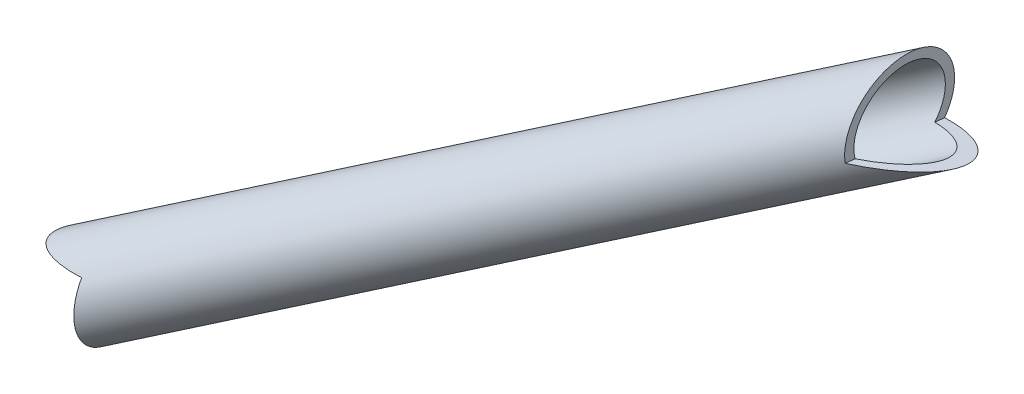
ISO-10303-21;
HEADER;
FILE_DESCRIPTION(('STEP AP214'),'2;1');
FILE_NAME('part.step','',(''),(''),'','','');
FILE_SCHEMA(('AUTOMOTIVE_DESIGN { 1 0 10303 214 1 1 1 1 }'));
ENDSEC;
DATA;
#1=APPLICATION_CONTEXT('core data for automotive mechanical design processes');
#2=APPLICATION_PROTOCOL_DEFINITION('international standard','automotive_design',2000,#1);
#3=PRODUCT_CONTEXT('',#1,'mechanical');
#4=PRODUCT('Part','Part','',(#3));
#5=PRODUCT_RELATED_PRODUCT_CATEGORY('part','',(#4));
#6=PRODUCT_DEFINITION_FORMATION('','',#4);
#7=PRODUCT_DEFINITION_CONTEXT('part definition',#1,'design');
#8=PRODUCT_DEFINITION('design','',#6,#7);
#9=PRODUCT_DEFINITION_SHAPE('','',#8);
#10=(LENGTH_UNIT() NAMED_UNIT(*) SI_UNIT(.MILLI.,.METRE.));
#11=(NAMED_UNIT(*) PLANE_ANGLE_UNIT() SI_UNIT($,.RADIAN.));
#12=(NAMED_UNIT(*) SI_UNIT($,.STERADIAN.) SOLID_ANGLE_UNIT());
#13=UNCERTAINTY_MEASURE_WITH_UNIT(LENGTH_MEASURE(1.E-05),#10,'distance_accuracy_value','');
#14=(GEOMETRIC_REPRESENTATION_CONTEXT(3) GLOBAL_UNCERTAINTY_ASSIGNED_CONTEXT((#13)) GLOBAL_UNIT_ASSIGNED_CONTEXT((#10,
#11,#12)) REPRESENTATION_CONTEXT('',''));
#15=CARTESIAN_POINT('',(0.,0.,0.));
#16=DIRECTION('',(0.,0.,1.));
#17=DIRECTION('',(1.,0.,0.));
#18=AXIS2_PLACEMENT_3D('',#15,#16,#17);
#19=CARTESIAN_POINT('',(60.0000000000001,-79.9999999999997,-1230.));
#20=DIRECTION('',(0.829530335169313,0.466321590167163,-0.307284229302213));
#21=DIRECTION('',(-0.490030345314348,0.871705374923833,0.));
#22=AXIS2_PLACEMENT_3D('',#19,#20,#21);
#23=CYLINDRICAL_SURFACE('',#22,9.49999999999999);
#24=CARTESIAN_POINT('',(191.800394642372,-5.90823143104675,-1278.8230278898));
#25=DIRECTION('',(0.993532672656404,0.,0.113546591160732));
#26=DIRECTION('',(0.0738720119307531,0.759431159814232,-0.646380104394088));
#27=AXIS2_PLACEMENT_3D('',#24,#25,#26);
#28=ELLIPSE('',#27,12.0363714180218,9.49999999999999);
#29=CARTESIAN_POINT('',(192.790177508074,-10.,-1287.48362796469));
#30=VERTEX_POINT('',#29);
#31=CARTESIAN_POINT('',(190.604637756446,-10.,-1268.36015513794));
#32=VERTEX_POINT('',#31);
#33=EDGE_CURVE('E89',#30,#32,#28,.T.);
#34=ORIENTED_EDGE('',*,*,#33,.F.);
#35=CARTESIAN_POINT('',(184.521627748431,-10.,-1276.12674279877));
#36=DIRECTION('',(0.,1.,0.));
#37=DIRECTION('',(0.937730066424403,0.,-0.347364826261505));
#38=AXIS2_PLACEMENT_3D('',#35,#36,#37);
#39=ELLIPSE('',#38,20.3722070783695,9.49999999999999);
#40=EDGE_CURVE('E83',#32,#30,#39,.T.);
#41=ORIENTED_EDGE('',*,*,#40,.F.);
#42=EDGE_LOOP('',(#34,#41));
#43=FACE_BOUND('',#42,.T.);
#44=CARTESIAN_POINT('',(77.7888039640615,-69.9999999999998,-1236.58953468554));
#45=DIRECTION('',(0.,-1.,0.));
#46=DIRECTION('',(0.937730066424403,0.,-0.347364826261505));
#47=AXIS2_PLACEMENT_3D('',#44,#45,#46);
#48=ELLIPSE('',#47,20.3722070783695,9.49999999999999);
#49=CARTESIAN_POINT('',(70.0000000000001,-69.9999999999998,-1225.25527457715));
#50=VERTEX_POINT('',#49);
#51=CARTESIAN_POINT('',(70.0000000000001,-69.9999999999998,-1243.53901067812));
#52=VERTEX_POINT('',#51);
#53=EDGE_CURVE('E92',#50,#52,#48,.T.);
#54=ORIENTED_EDGE('',*,*,#53,.F.);
#55=CARTESIAN_POINT('',(70.0000000000001,-74.3784865917892,-1233.70431575886));
#56=DIRECTION('',(-1.,0.,0.));
#57=DIRECTION('',(0.,0.835010933701049,-0.550233351042721));
#58=AXIS2_PLACEMENT_3D('',#55,#56,#57);
#59=ELLIPSE('',#58,11.4522635245895,9.49999999999999);
#60=EDGE_CURVE('E103',#52,#50,#59,.T.);
#61=ORIENTED_EDGE('',*,*,#60,.F.);
#62=EDGE_LOOP('',(#54,#61));
#63=FACE_BOUND('',#62,.T.);
#64=ADVANCED_FACE('F41',(#43,#63),#23,.T.);
#65=CARTESIAN_POINT('',(259.935326726564,-10.,-1698.86453408839));
#66=DIRECTION('',(0.,1.,0.));
#67=DIRECTION('',(0.,0.,1.));
#68=AXIS2_PLACEMENT_3D('',#65,#66,#67);
#69=PLANE('',#68);
#70=DIRECTION('',(-0.113546591160732,0.,0.993532672656404));
#71=VECTOR('',#70,1.);
#72=CARTESIAN_POINT('',(240.064673273436,-10.,-1701.13546591161));
#73=LINE('',#72,#71);
#74=CARTESIAN_POINT('',(190.821594147956,-10.,-1270.25852356366));
#75=VERTEX_POINT('',#74);
#76=EDGE_CURVE('E44',#75,#32,#73,.T.);
#77=ORIENTED_EDGE('',*,*,#76,.T.);
#78=ORIENTED_EDGE('',*,*,#40,.T.);
#79=CARTESIAN_POINT('',(192.573221116564,-10.,-1285.58525953898));
#80=VERTEX_POINT('',#79);
#81=EDGE_CURVE('E80',#30,#80,#73,.T.);
#82=ORIENTED_EDGE('',*,*,#81,.T.);
#83=CARTESIAN_POINT('',(184.521627748431,-10.,-1276.12674279877));
#84=DIRECTION('',(0.,1.,0.));
#85=DIRECTION('',(0.937730066424403,0.,-0.347364826261505));
#86=AXIS2_PLACEMENT_3D('',#83,#84,#85);
#87=ELLIPSE('',#86,16.941098517802,7.90000000000002);
#88=EDGE_CURVE('E75',#75,#80,#87,.T.);
#89=ORIENTED_EDGE('',*,*,#88,.F.);
#90=EDGE_LOOP('',(#77,#78,#82,#89));
#91=FACE_BOUND('',#90,.T.);
#92=ADVANCED_FACE('F85',(#91),#69,.T.);
#93=CARTESIAN_POINT('',(240.064673273436,10.,-1701.13546591161));
#94=DIRECTION('',(0.993532672656404,0.,0.113546591160732));
#95=DIRECTION('',(0.113546591160732,0.,-0.993532672656404));
#96=AXIS2_PLACEMENT_3D('',#93,#94,#95);
#97=PLANE('',#96);
#98=ORIENTED_EDGE('',*,*,#81,.F.);
#99=ORIENTED_EDGE('',*,*,#33,.T.);
#100=ORIENTED_EDGE('',*,*,#76,.F.);
#101=CARTESIAN_POINT('',(191.800394642372,-5.90823143104675,-1278.8230278898));
#102=DIRECTION('',(0.993532672656404,0.,0.113546591160732));
#103=DIRECTION('',(0.0738720119307531,0.759431159814232,-0.646380104394088));
#104=AXIS2_PLACEMENT_3D('',#101,#102,#103);
#105=ELLIPSE('',#104,10.009193073934,7.90000000000002);
#106=EDGE_CURVE('E99',#80,#75,#105,.T.);
#107=ORIENTED_EDGE('',*,*,#106,.F.);
#108=EDGE_LOOP('',(#98,#99,#100,#107));
#109=FACE_BOUND('',#108,.T.);
#110=ADVANCED_FACE('F90',(#109),#97,.T.);
#111=CARTESIAN_POINT('',(70.0000000000001,-69.9999999999998,-1085.));
#112=DIRECTION('',(0.,-1.,0.));
#113=DIRECTION('',(0.,0.,-1.));
#114=AXIS2_PLACEMENT_3D('',#111,#112,#113);
#115=PLANE('',#114);
#116=DIRECTION('',(0.,0.,-1.));
#117=VECTOR('',#116,1.);
#118=CARTESIAN_POINT('',(70.0000000000001,-69.9999999999998,-1085.));
#119=LINE('',#118,#117);
#120=CARTESIAN_POINT('',(70.0000000000001,-69.9999999999998,-1227.12865579034));
#121=VERTEX_POINT('',#120);
#122=EDGE_CURVE('E101',#50,#121,#119,.T.);
#123=ORIENTED_EDGE('',*,*,#122,.F.);
#124=ORIENTED_EDGE('',*,*,#53,.T.);
#125=CARTESIAN_POINT('',(70.0000000000001,-69.9999999999998,-1241.66562946492));
#126=VERTEX_POINT('',#125);
#127=EDGE_CURVE('E102',#126,#52,#119,.T.);
#128=ORIENTED_EDGE('',*,*,#127,.F.);
#129=CARTESIAN_POINT('',(77.7888039640615,-69.9999999999998,-1236.58953468554));
#130=DIRECTION('',(0.,-1.,0.));
#131=DIRECTION('',(0.937730066424403,0.,-0.347364826261505));
#132=AXIS2_PLACEMENT_3D('',#129,#130,#131);
#133=ELLIPSE('',#132,16.941098517802,7.90000000000002);
#134=EDGE_CURVE('E11',#121,#126,#133,.T.);
#135=ORIENTED_EDGE('',*,*,#134,.F.);
#136=EDGE_LOOP('',(#123,#124,#128,#135));
#137=FACE_BOUND('',#136,.T.);
#138=ADVANCED_FACE('F112',(#137),#115,.T.);
#139=CARTESIAN_POINT('',(70.0000000000001,-89.9999999999998,-1085.));
#140=DIRECTION('',(-1.,0.,0.));
#141=DIRECTION('',(0.,0.,1.));
#142=AXIS2_PLACEMENT_3D('',#139,#140,#141);
#143=PLANE('',#142);
#144=ORIENTED_EDGE('',*,*,#127,.T.);
#145=ORIENTED_EDGE('',*,*,#60,.T.);
#146=ORIENTED_EDGE('',*,*,#122,.T.);
#147=CARTESIAN_POINT('',(70.0000000000001,-74.3784865917892,-1233.70431575886));
#148=DIRECTION('',(-1.,0.,0.));
#149=DIRECTION('',(0.,0.835010933701049,-0.550233351042721));
#150=AXIS2_PLACEMENT_3D('',#147,#148,#149);
#151=ELLIPSE('',#150,9.52346124676389,7.90000000000002);
#152=EDGE_CURVE('E50',#126,#121,#151,.T.);
#153=ORIENTED_EDGE('',*,*,#152,.F.);
#154=EDGE_LOOP('',(#144,#145,#146,#153));
#155=FACE_BOUND('',#154,.T.);
#156=ADVANCED_FACE('F108',(#155),#143,.T.);
#157=CARTESIAN_POINT('',(60.0000000000001,-79.9999999999997,-1230.));
#158=DIRECTION('',(0.829530335169313,0.466321590167163,-0.307284229302213));
#159=DIRECTION('',(-0.490030345314348,0.871705374923833,0.));
#160=AXIS2_PLACEMENT_3D('',#157,#158,#159);
#161=CYLINDRICAL_SURFACE('',#160,7.90000000000002);
#162=ORIENTED_EDGE('',*,*,#88,.T.);
#163=ORIENTED_EDGE('',*,*,#106,.T.);
#164=EDGE_LOOP('',(#162,#163));
#165=FACE_BOUND('',#164,.T.);
#166=ORIENTED_EDGE('',*,*,#152,.T.);
#167=ORIENTED_EDGE('',*,*,#134,.T.);
#168=EDGE_LOOP('',(#166,#167));
#169=FACE_BOUND('',#168,.T.);
#170=ADVANCED_FACE('F114',(#165,#169),#161,.F.);
#171=CLOSED_SHELL('',(#64,#92,#110,#138,#156,#170));
#172=MANIFOLD_SOLID_BREP('B2',#171);
#173=ADVANCED_BREP_SHAPE_REPRESENTATION('',(#18,#172),#14);
#174=SHAPE_DEFINITION_REPRESENTATION(#9,#173);
ENDSEC;
END-ISO-10303-21;
